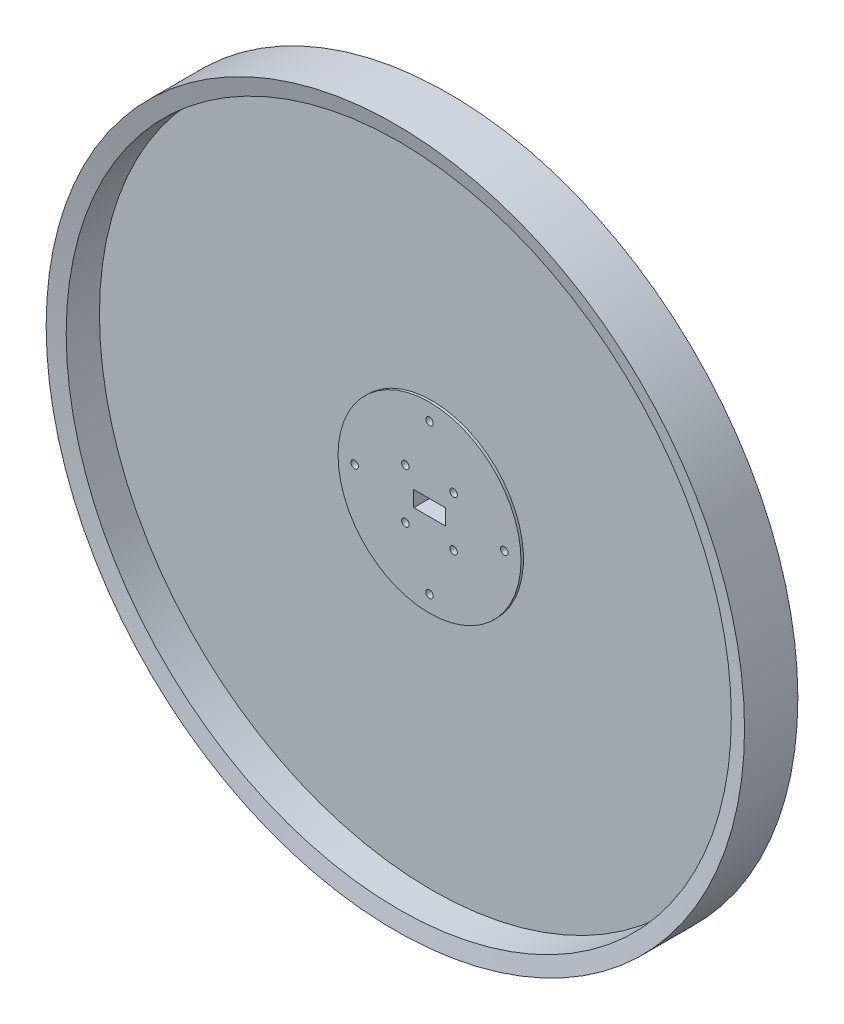
ISO-10303-21;
HEADER;
FILE_DESCRIPTION(('STEP AP214'),'2;1');
FILE_NAME('part.step','',(''),(''),'','','');
FILE_SCHEMA(('AUTOMOTIVE_DESIGN { 1 0 10303 214 1 1 1 1 }'));
ENDSEC;
DATA;
#1=APPLICATION_CONTEXT('core data for automotive mechanical design processes');
#2=APPLICATION_PROTOCOL_DEFINITION('international standard','automotive_design',2000,#1);
#3=PRODUCT_CONTEXT('',#1,'mechanical');
#4=PRODUCT('Part','Part','',(#3));
#5=PRODUCT_RELATED_PRODUCT_CATEGORY('part','',(#4));
#6=PRODUCT_DEFINITION_FORMATION('','',#4);
#7=PRODUCT_DEFINITION_CONTEXT('part definition',#1,'design');
#8=PRODUCT_DEFINITION('design','',#6,#7);
#9=PRODUCT_DEFINITION_SHAPE('','',#8);
#10=(LENGTH_UNIT() NAMED_UNIT(*) SI_UNIT(.MILLI.,.METRE.));
#11=(NAMED_UNIT(*) PLANE_ANGLE_UNIT() SI_UNIT($,.RADIAN.));
#12=(NAMED_UNIT(*) SI_UNIT($,.STERADIAN.) SOLID_ANGLE_UNIT());
#13=UNCERTAINTY_MEASURE_WITH_UNIT(LENGTH_MEASURE(1.E-05),#10,'distance_accuracy_value','');
#14=(GEOMETRIC_REPRESENTATION_CONTEXT(3) GLOBAL_UNCERTAINTY_ASSIGNED_CONTEXT((#13)) GLOBAL_UNIT_ASSIGNED_CONTEXT((#10,
#11,#12)) REPRESENTATION_CONTEXT('',''));
#15=CARTESIAN_POINT('',(0.,0.,0.));
#16=DIRECTION('',(0.,0.,1.));
#17=DIRECTION('',(1.,0.,0.));
#18=AXIS2_PLACEMENT_3D('',#15,#16,#17);
#19=CARTESIAN_POINT('',(0.,0.,-9.99999999999996));
#20=DIRECTION('',(0.,0.,-1.));
#21=DIRECTION('',(-1.,0.,0.));
#22=AXIS2_PLACEMENT_3D('',#19,#20,#21);
#23=CYLINDRICAL_SURFACE('',#22,199.999999999999);
#24=CARTESIAN_POINT('',(0.,0.,19.9999999999996));
#25=DIRECTION('',(0.,0.,-1.));
#26=DIRECTION('',(-1.,0.,0.));
#27=AXIS2_PLACEMENT_3D('',#24,#25,#26);
#28=CIRCLE('',#27,199.999999999997);
#29=CARTESIAN_POINT('',(-199.999999999997,0.,19.9999999999996));
#30=VERTEX_POINT('',#29);
#31=EDGE_CURVE('E110',#30,#30,#28,.T.);
#32=ORIENTED_EDGE('',*,*,#31,.F.);
#33=EDGE_LOOP('',(#32));
#34=FACE_BOUND('',#33,.T.);
#35=CARTESIAN_POINT('',(0.,0.,0.));
#36=DIRECTION('',(0.,0.,-1.));
#37=DIRECTION('',(-1.,0.,0.));
#38=AXIS2_PLACEMENT_3D('',#35,#36,#37);
#39=CIRCLE('',#38,200.);
#40=CARTESIAN_POINT('',(-200.,0.,0.));
#41=VERTEX_POINT('',#40);
#42=EDGE_CURVE('E40',#41,#41,#39,.T.);
#43=ORIENTED_EDGE('',*,*,#42,.T.);
#44=EDGE_LOOP('',(#43));
#45=FACE_BOUND('',#44,.T.);
#46=ADVANCED_FACE('F32',(#34,#45),#23,.F.);
#47=CARTESIAN_POINT('',(0.,0.,0.));
#48=DIRECTION('',(0.,0.,-1.));
#49=DIRECTION('',(-1.,0.,0.));
#50=AXIS2_PLACEMENT_3D('',#47,#48,#49);
#51=PLANE('',#50);
#52=CARTESIAN_POINT('',(0.,0.,0.));
#53=DIRECTION('',(0.,0.,-1.));
#54=DIRECTION('',(-1.,0.,0.));
#55=AXIS2_PLACEMENT_3D('',#52,#53,#54);
#56=CIRCLE('',#55,55.);
#57=CARTESIAN_POINT('',(-55.,0.,0.));
#58=VERTEX_POINT('',#57);
#59=EDGE_CURVE('E11',#58,#58,#56,.F.);
#60=ORIENTED_EDGE('',*,*,#59,.F.);
#61=EDGE_LOOP('',(#60));
#62=FACE_BOUND('',#61,.T.);
#63=ORIENTED_EDGE('',*,*,#42,.F.);
#64=EDGE_LOOP('',(#63));
#65=FACE_BOUND('',#64,.T.);
#66=ADVANCED_FACE('F188',(#62,#65),#51,.F.);
#67=CARTESIAN_POINT('',(210.,0.,-9.99999999999997));
#68=DIRECTION('',(0.,0.,1.));
#69=DIRECTION('',(1.,0.,0.));
#70=AXIS2_PLACEMENT_3D('',#67,#68,#69);
#71=PLANE('',#70);
#72=CARTESIAN_POINT('',(-14.5,15.,-9.99999999999999));
#73=DIRECTION('',(0.,0.,-1.));
#74=DIRECTION('',(-1.,0.,0.));
#75=AXIS2_PLACEMENT_3D('',#72,#73,#74);
#76=CIRCLE('',#75,2.275);
#77=CARTESIAN_POINT('',(-16.775,15.,-9.99999999999999));
#78=VERTEX_POINT('',#77);
#79=EDGE_CURVE('E283',#78,#78,#76,.T.);
#80=ORIENTED_EDGE('',*,*,#79,.F.);
#81=EDGE_LOOP('',(#80));
#82=FACE_BOUND('',#81,.T.);
#83=CARTESIAN_POINT('',(14.5,15.,-9.99999999999999));
#84=DIRECTION('',(0.,0.,-1.));
#85=DIRECTION('',(-1.,0.,0.));
#86=AXIS2_PLACEMENT_3D('',#83,#84,#85);
#87=CIRCLE('',#86,2.275);
#88=CARTESIAN_POINT('',(12.225,15.,-9.99999999999999));
#89=VERTEX_POINT('',#88);
#90=EDGE_CURVE('E141',#89,#89,#87,.T.);
#91=ORIENTED_EDGE('',*,*,#90,.F.);
#92=EDGE_LOOP('',(#91));
#93=FACE_BOUND('',#92,.T.);
#94=CARTESIAN_POINT('',(14.5,-15.,-9.99999999999999));
#95=DIRECTION('',(0.,0.,-1.));
#96=DIRECTION('',(-1.,0.,0.));
#97=AXIS2_PLACEMENT_3D('',#94,#95,#96);
#98=CIRCLE('',#97,2.275);
#99=CARTESIAN_POINT('',(12.225,-15.,-9.99999999999999));
#100=VERTEX_POINT('',#99);
#101=EDGE_CURVE('E134',#100,#100,#98,.T.);
#102=ORIENTED_EDGE('',*,*,#101,.F.);
#103=EDGE_LOOP('',(#102));
#104=FACE_BOUND('',#103,.T.);
#105=CARTESIAN_POINT('',(-14.5,-15.,-9.99999999999999));
#106=DIRECTION('',(0.,0.,-1.));
#107=DIRECTION('',(-1.,0.,0.));
#108=AXIS2_PLACEMENT_3D('',#105,#106,#107);
#109=CIRCLE('',#108,2.275);
#110=CARTESIAN_POINT('',(-16.775,-15.,-9.99999999999999));
#111=VERTEX_POINT('',#110);
#112=EDGE_CURVE('E130',#111,#111,#109,.T.);
#113=ORIENTED_EDGE('',*,*,#112,.F.);
#114=EDGE_LOOP('',(#113));
#115=FACE_BOUND('',#114,.T.);
#116=CARTESIAN_POINT('',(45.,4.71349980743823E-13,-10.));
#117=DIRECTION('',(0.,0.,1.));
#118=DIRECTION('',(1.,0.,0.));
#119=AXIS2_PLACEMENT_3D('',#116,#117,#118);
#120=CIRCLE('',#119,2.25);
#121=CARTESIAN_POINT('',(47.25,4.71349980743823E-13,-10.));
#122=VERTEX_POINT('',#121);
#123=EDGE_CURVE('E157',#122,#122,#120,.T.);
#124=ORIENTED_EDGE('',*,*,#123,.T.);
#125=EDGE_LOOP('',(#124));
#126=FACE_BOUND('',#125,.T.);
#127=CARTESIAN_POINT('',(0.,-45.,-10.));
#128=DIRECTION('',(0.,0.,1.));
#129=DIRECTION('',(1.,0.,0.));
#130=AXIS2_PLACEMENT_3D('',#127,#128,#129);
#131=CIRCLE('',#130,2.25);
#132=CARTESIAN_POINT('',(2.25,-45.,-10.));
#133=VERTEX_POINT('',#132);
#134=EDGE_CURVE('E163',#133,#133,#131,.T.);
#135=ORIENTED_EDGE('',*,*,#134,.T.);
#136=EDGE_LOOP('',(#135));
#137=FACE_BOUND('',#136,.T.);
#138=CARTESIAN_POINT('',(-45.,-1.57116660247941E-13,-10.));
#139=DIRECTION('',(0.,0.,1.));
#140=DIRECTION('',(1.,0.,0.));
#141=AXIS2_PLACEMENT_3D('',#138,#139,#140);
#142=CIRCLE('',#141,2.25);
#143=CARTESIAN_POINT('',(-42.75,-1.57116660247941E-13,-10.));
#144=VERTEX_POINT('',#143);
#145=EDGE_CURVE('E169',#144,#144,#142,.T.);
#146=ORIENTED_EDGE('',*,*,#145,.T.);
#147=EDGE_LOOP('',(#146));
#148=FACE_BOUND('',#147,.T.);
#149=CARTESIAN_POINT('',(0.,45.,-10.));
#150=DIRECTION('',(0.,0.,1.));
#151=DIRECTION('',(1.,0.,0.));
#152=AXIS2_PLACEMENT_3D('',#149,#150,#151);
#153=CIRCLE('',#152,2.25);
#154=CARTESIAN_POINT('',(2.25,45.,-10.));
#155=VERTEX_POINT('',#154);
#156=EDGE_CURVE('E175',#155,#155,#153,.T.);
#157=ORIENTED_EDGE('',*,*,#156,.T.);
#158=EDGE_LOOP('',(#157));
#159=FACE_BOUND('',#158,.T.);
#160=DIRECTION('',(1.,0.,0.));
#161=VECTOR('',#160,1.);
#162=CARTESIAN_POINT('',(-9.5,-4.75,-10.));
#163=LINE('',#162,#161);
#164=CARTESIAN_POINT('',(-9.5,-4.75,-10.));
#165=VERTEX_POINT('',#164);
#166=CARTESIAN_POINT('',(9.5,-4.75,-10.));
#167=VERTEX_POINT('',#166);
#168=EDGE_CURVE('E105',#165,#167,#163,.T.);
#169=ORIENTED_EDGE('',*,*,#168,.T.);
#170=DIRECTION('',(0.,1.,0.));
#171=VECTOR('',#170,1.);
#172=CARTESIAN_POINT('',(9.5,-4.75,-10.));
#173=LINE('',#172,#171);
#174=CARTESIAN_POINT('',(9.5,4.75,-10.));
#175=VERTEX_POINT('',#174);
#176=EDGE_CURVE('E99',#167,#175,#173,.T.);
#177=ORIENTED_EDGE('',*,*,#176,.T.);
#178=DIRECTION('',(-1.,0.,0.));
#179=VECTOR('',#178,1.);
#180=CARTESIAN_POINT('',(-9.5,4.75,-10.));
#181=LINE('',#180,#179);
#182=CARTESIAN_POINT('',(-9.50000000000001,4.75,-9.99999999999998));
#183=VERTEX_POINT('',#182);
#184=EDGE_CURVE('E102',#175,#183,#181,.T.);
#185=ORIENTED_EDGE('',*,*,#184,.T.);
#186=DIRECTION('',(0.,-1.,0.));
#187=VECTOR('',#186,1.);
#188=CARTESIAN_POINT('',(-9.5,-4.75,-10.));
#189=LINE('',#188,#187);
#190=EDGE_CURVE('E56',#183,#165,#189,.T.);
#191=ORIENTED_EDGE('',*,*,#190,.T.);
#192=EDGE_LOOP('',(#169,#177,#185,#191));
#193=FACE_BOUND('',#192,.T.);
#194=CARTESIAN_POINT('',(0.,0.,-9.99999999999999));
#195=DIRECTION('',(0.,0.,-1.));
#196=DIRECTION('',(-1.,0.,0.));
#197=AXIS2_PLACEMENT_3D('',#194,#195,#196);
#198=CIRCLE('',#197,210.);
#199=CARTESIAN_POINT('',(-210.,0.,-10.));
#200=VERTEX_POINT('',#199);
#201=EDGE_CURVE('E118',#200,#200,#198,.T.);
#202=ORIENTED_EDGE('',*,*,#201,.T.);
#203=EDGE_LOOP('',(#202));
#204=FACE_BOUND('',#203,.T.);
#205=ADVANCED_FACE('F184',(#82,#93,#104,#115,#126,#137,#148,#159,#193,#204),#71,.F.);
#206=CARTESIAN_POINT('',(0.,0.,-9.99999999999996));
#207=DIRECTION('',(0.,0.,-1.));
#208=DIRECTION('',(-1.,0.,0.));
#209=AXIS2_PLACEMENT_3D('',#206,#207,#208);
#210=CYLINDRICAL_SURFACE('',#209,210.000000000002);
#211=ORIENTED_EDGE('',*,*,#201,.F.);
#212=EDGE_LOOP('',(#211));
#213=FACE_BOUND('',#212,.T.);
#214=CARTESIAN_POINT('',(0.,0.,22.0500000000006));
#215=DIRECTION('',(0.,0.,-1.));
#216=DIRECTION('',(-1.,0.,0.));
#217=AXIS2_PLACEMENT_3D('',#214,#215,#216);
#218=CIRCLE('',#217,210.000000000004);
#219=CARTESIAN_POINT('',(-210.000000000004,0.,22.0500000000006));
#220=VERTEX_POINT('',#219);
#221=EDGE_CURVE('E115',#220,#220,#218,.T.);
#222=ORIENTED_EDGE('',*,*,#221,.T.);
#223=EDGE_LOOP('',(#222));
#224=FACE_BOUND('',#223,.T.);
#225=ADVANCED_FACE('F187',(#213,#224),#210,.T.);
#226=CARTESIAN_POINT('',(0.,0.,19.9999999999996));
#227=DIRECTION('',(0.,0.,1.));
#228=DIRECTION('',(1.,0.,0.));
#229=AXIS2_PLACEMENT_3D('',#226,#227,#228);
#230=CONICAL_SURFACE('',#229,199.999999999997,1.36859772991208);
#231=ORIENTED_EDGE('',*,*,#221,.F.);
#232=EDGE_LOOP('',(#231));
#233=FACE_BOUND('',#232,.T.);
#234=ORIENTED_EDGE('',*,*,#31,.T.);
#235=EDGE_LOOP('',(#234));
#236=FACE_BOUND('',#235,.T.);
#237=ADVANCED_FACE('F195',(#233,#236),#230,.F.);
#238=CARTESIAN_POINT('',(9.5,-4.75,-10.));
#239=DIRECTION('',(1.,0.,0.));
#240=DIRECTION('',(0.,0.,-1.));
#241=AXIS2_PLACEMENT_3D('',#238,#239,#240);
#242=PLANE('',#241);
#243=DIRECTION('',(0.,0.,1.));
#244=VECTOR('',#243,1.);
#245=CARTESIAN_POINT('',(9.5,-4.75,-10.));
#246=LINE('',#245,#244);
#247=CARTESIAN_POINT('',(9.50000000000001,-4.75,1.51249999997172));
#248=VERTEX_POINT('',#247);
#249=EDGE_CURVE('E108',#167,#248,#246,.T.);
#250=ORIENTED_EDGE('',*,*,#249,.T.);
#251=DIRECTION('',(0.,1.,0.));
#252=VECTOR('',#251,1.);
#253=CARTESIAN_POINT('',(9.50000000000001,-4.75,1.51249999997172));
#254=LINE('',#253,#252);
#255=CARTESIAN_POINT('',(9.50000000000001,4.75,1.51249999997172));
#256=VERTEX_POINT('',#255);
#257=EDGE_CURVE('E86',#248,#256,#254,.T.);
#258=ORIENTED_EDGE('',*,*,#257,.T.);
#259=DIRECTION('',(0.,0.,1.));
#260=VECTOR('',#259,1.);
#261=CARTESIAN_POINT('',(9.5,4.75,-10.));
#262=LINE('',#261,#260);
#263=EDGE_CURVE('E48',#175,#256,#262,.T.);
#264=ORIENTED_EDGE('',*,*,#263,.F.);
#265=ORIENTED_EDGE('',*,*,#176,.F.);
#266=EDGE_LOOP('',(#250,#258,#264,#265));
#267=FACE_BOUND('',#266,.T.);
#268=ADVANCED_FACE('F178',(#267),#242,.F.);
#269=CARTESIAN_POINT('',(-9.5,-4.75,-10.));
#270=DIRECTION('',(0.,-1.,0.));
#271=DIRECTION('',(0.,0.,-1.));
#272=AXIS2_PLACEMENT_3D('',#269,#270,#271);
#273=PLANE('',#272);
#274=DIRECTION('',(0.,0.,1.));
#275=VECTOR('',#274,1.);
#276=CARTESIAN_POINT('',(-9.5,-4.75,-10.));
#277=LINE('',#276,#275);
#278=CARTESIAN_POINT('',(-9.49999999999999,-4.75,1.51249999997172));
#279=VERTEX_POINT('',#278);
#280=EDGE_CURVE('E79',#165,#279,#277,.T.);
#281=ORIENTED_EDGE('',*,*,#280,.T.);
#282=DIRECTION('',(1.,0.,0.));
#283=VECTOR('',#282,1.);
#284=CARTESIAN_POINT('',(-9.49999999999999,-4.75,1.51249999997172));
#285=LINE('',#284,#283);
#286=EDGE_CURVE('E91',#279,#248,#285,.T.);
#287=ORIENTED_EDGE('',*,*,#286,.T.);
#288=ORIENTED_EDGE('',*,*,#249,.F.);
#289=ORIENTED_EDGE('',*,*,#168,.F.);
#290=EDGE_LOOP('',(#281,#287,#288,#289));
#291=FACE_BOUND('',#290,.T.);
#292=ADVANCED_FACE('F182',(#291),#273,.F.);
#293=CARTESIAN_POINT('',(-9.5,-4.75,-10.));
#294=DIRECTION('',(-1.,0.,0.));
#295=DIRECTION('',(0.,0.,1.));
#296=AXIS2_PLACEMENT_3D('',#293,#294,#295);
#297=PLANE('',#296);
#298=DIRECTION('',(0.,0.,1.));
#299=VECTOR('',#298,1.);
#300=CARTESIAN_POINT('',(-9.5,4.75,-10.));
#301=LINE('',#300,#299);
#302=CARTESIAN_POINT('',(-9.49999999999999,4.75,1.51249999997172));
#303=VERTEX_POINT('',#302);
#304=EDGE_CURVE('E73',#183,#303,#301,.T.);
#305=ORIENTED_EDGE('',*,*,#304,.T.);
#306=DIRECTION('',(0.,-1.,0.));
#307=VECTOR('',#306,1.);
#308=CARTESIAN_POINT('',(-9.49999999999999,-4.75,1.51249999997172));
#309=LINE('',#308,#307);
#310=EDGE_CURVE('E76',#303,#279,#309,.T.);
#311=ORIENTED_EDGE('',*,*,#310,.T.);
#312=ORIENTED_EDGE('',*,*,#280,.F.);
#313=ORIENTED_EDGE('',*,*,#190,.F.);
#314=EDGE_LOOP('',(#305,#311,#312,#313));
#315=FACE_BOUND('',#314,.T.);
#316=ADVANCED_FACE('F74',(#315),#297,.F.);
#317=CARTESIAN_POINT('',(-9.5,4.75,-10.));
#318=DIRECTION('',(0.,1.,0.));
#319=DIRECTION('',(0.,0.,1.));
#320=AXIS2_PLACEMENT_3D('',#317,#318,#319);
#321=PLANE('',#320);
#322=ORIENTED_EDGE('',*,*,#263,.T.);
#323=DIRECTION('',(-1.,0.,0.));
#324=VECTOR('',#323,1.);
#325=CARTESIAN_POINT('',(-9.49999999999999,4.75,1.51249999997172));
#326=LINE('',#325,#324);
#327=EDGE_CURVE('E82',#256,#303,#326,.T.);
#328=ORIENTED_EDGE('',*,*,#327,.T.);
#329=ORIENTED_EDGE('',*,*,#304,.F.);
#330=ORIENTED_EDGE('',*,*,#184,.F.);
#331=EDGE_LOOP('',(#322,#328,#329,#330));
#332=FACE_BOUND('',#331,.T.);
#333=ADVANCED_FACE('F83',(#332),#321,.F.);
#334=CARTESIAN_POINT('',(0.,0.,157.075991861012));
#335=DIRECTION('',(0.,0.,-1.));
#336=DIRECTION('',(-1.,0.,0.));
#337=AXIS2_PLACEMENT_3D('',#334,#335,#336);
#338=CYLINDRICAL_SURFACE('',#337,55.);
#339=ORIENTED_EDGE('',*,*,#59,.T.);
#340=EDGE_LOOP('',(#339));
#341=FACE_BOUND('',#340,.T.);
#342=CARTESIAN_POINT('',(0.,0.,1.51249999997172));
#343=DIRECTION('',(0.,0.,1.));
#344=DIRECTION('',(1.,0.,0.));
#345=AXIS2_PLACEMENT_3D('',#342,#343,#344);
#346=CIRCLE('',#345,55.);
#347=CARTESIAN_POINT('',(55.,0.,1.51249999997172));
#348=VERTEX_POINT('',#347);
#349=EDGE_CURVE('E93',#348,#348,#346,.T.);
#350=ORIENTED_EDGE('',*,*,#349,.F.);
#351=EDGE_LOOP('',(#350));
#352=FACE_BOUND('',#351,.T.);
#353=ADVANCED_FACE('F218',(#341,#352),#338,.T.);
#354=CARTESIAN_POINT('',(0.,0.,1.51249999997172));
#355=DIRECTION('',(0.,0.,1.));
#356=DIRECTION('',(1.,0.,0.));
#357=AXIS2_PLACEMENT_3D('',#354,#355,#356);
#358=PLANE('',#357);
#359=CARTESIAN_POINT('',(-14.5,15.,1.51249999997172));
#360=DIRECTION('',(0.,0.,1.));
#361=DIRECTION('',(1.,0.,0.));
#362=AXIS2_PLACEMENT_3D('',#359,#360,#361);
#363=CIRCLE('',#362,2.25);
#364=CARTESIAN_POINT('',(-12.25,15.,1.51249999997172));
#365=VERTEX_POINT('',#364);
#366=EDGE_CURVE('E35',#365,#365,#363,.T.);
#367=ORIENTED_EDGE('',*,*,#366,.F.);
#368=EDGE_LOOP('',(#367));
#369=FACE_BOUND('',#368,.T.);
#370=CARTESIAN_POINT('',(14.5,15.,1.51249999997172));
#371=DIRECTION('',(0.,0.,1.));
#372=DIRECTION('',(1.,0.,0.));
#373=AXIS2_PLACEMENT_3D('',#370,#371,#372);
#374=CIRCLE('',#373,2.25);
#375=CARTESIAN_POINT('',(16.75,15.,1.51249999997172));
#376=VERTEX_POINT('',#375);
#377=EDGE_CURVE('E132',#376,#376,#374,.T.);
#378=ORIENTED_EDGE('',*,*,#377,.F.);
#379=EDGE_LOOP('',(#378));
#380=FACE_BOUND('',#379,.T.);
#381=CARTESIAN_POINT('',(14.5,-15.,1.51249999997172));
#382=DIRECTION('',(0.,0.,1.));
#383=DIRECTION('',(1.,0.,0.));
#384=AXIS2_PLACEMENT_3D('',#381,#382,#383);
#385=CIRCLE('',#384,2.25);
#386=CARTESIAN_POINT('',(16.75,-15.,1.51249999997172));
#387=VERTEX_POINT('',#386);
#388=EDGE_CURVE('E128',#387,#387,#385,.T.);
#389=ORIENTED_EDGE('',*,*,#388,.F.);
#390=EDGE_LOOP('',(#389));
#391=FACE_BOUND('',#390,.T.);
#392=CARTESIAN_POINT('',(-14.5,-15.,1.51249999997172));
#393=DIRECTION('',(0.,0.,1.));
#394=DIRECTION('',(1.,0.,0.));
#395=AXIS2_PLACEMENT_3D('',#392,#393,#394);
#396=CIRCLE('',#395,2.25);
#397=CARTESIAN_POINT('',(-12.25,-15.,1.51249999997172));
#398=VERTEX_POINT('',#397);
#399=EDGE_CURVE('E123',#398,#398,#396,.T.);
#400=ORIENTED_EDGE('',*,*,#399,.F.);
#401=EDGE_LOOP('',(#400));
#402=FACE_BOUND('',#401,.T.);
#403=CARTESIAN_POINT('',(45.,4.71349980743823E-13,1.51249999997173));
#404=DIRECTION('',(0.,0.,1.));
#405=DIRECTION('',(1.,0.,0.));
#406=AXIS2_PLACEMENT_3D('',#403,#404,#405);
#407=CIRCLE('',#406,2.24999999999999);
#408=CARTESIAN_POINT('',(47.25,4.71349980743823E-13,1.51249999997173));
#409=VERTEX_POINT('',#408);
#410=EDGE_CURVE('E126',#409,#409,#407,.T.);
#411=ORIENTED_EDGE('',*,*,#410,.F.);
#412=EDGE_LOOP('',(#411));
#413=FACE_BOUND('',#412,.T.);
#414=CARTESIAN_POINT('',(0.,-45.,1.51249999997173));
#415=DIRECTION('',(0.,0.,1.));
#416=DIRECTION('',(1.,0.,0.));
#417=AXIS2_PLACEMENT_3D('',#414,#415,#416);
#418=CIRCLE('',#417,2.24999999999999);
#419=CARTESIAN_POINT('',(2.24999999999999,-45.,1.51249999997173));
#420=VERTEX_POINT('',#419);
#421=EDGE_CURVE('E160',#420,#420,#418,.T.);
#422=ORIENTED_EDGE('',*,*,#421,.F.);
#423=EDGE_LOOP('',(#422));
#424=FACE_BOUND('',#423,.T.);
#425=CARTESIAN_POINT('',(-45.,-1.57116660247941E-13,1.51249999997173));
#426=DIRECTION('',(0.,0.,1.));
#427=DIRECTION('',(1.,0.,0.));
#428=AXIS2_PLACEMENT_3D('',#425,#426,#427);
#429=CIRCLE('',#428,2.24999999999999);
#430=CARTESIAN_POINT('',(-42.75,-1.57116660247941E-13,1.51249999997173));
#431=VERTEX_POINT('',#430);
#432=EDGE_CURVE('E166',#431,#431,#429,.T.);
#433=ORIENTED_EDGE('',*,*,#432,.F.);
#434=EDGE_LOOP('',(#433));
#435=FACE_BOUND('',#434,.T.);
#436=CARTESIAN_POINT('',(0.,45.,1.51249999997173));
#437=DIRECTION('',(0.,0.,1.));
#438=DIRECTION('',(1.,0.,0.));
#439=AXIS2_PLACEMENT_3D('',#436,#437,#438);
#440=CIRCLE('',#439,2.24999999999999);
#441=CARTESIAN_POINT('',(2.24999999999999,45.,1.51249999997173));
#442=VERTEX_POINT('',#441);
#443=EDGE_CURVE('E172',#442,#442,#440,.T.);
#444=ORIENTED_EDGE('',*,*,#443,.F.);
#445=EDGE_LOOP('',(#444));
#446=FACE_BOUND('',#445,.T.);
#447=ORIENTED_EDGE('',*,*,#257,.F.);
#448=ORIENTED_EDGE('',*,*,#286,.F.);
#449=ORIENTED_EDGE('',*,*,#310,.F.);
#450=ORIENTED_EDGE('',*,*,#327,.F.);
#451=EDGE_LOOP('',(#447,#448,#449,#450));
#452=FACE_BOUND('',#451,.T.);
#453=ORIENTED_EDGE('',*,*,#349,.T.);
#454=EDGE_LOOP('',(#453));
#455=FACE_BOUND('',#454,.T.);
#456=ADVANCED_FACE('F88',(#369,#380,#391,#402,#413,#424,#435,#446,#452,#455),#358,.T.);
#457=CARTESIAN_POINT('',(0.,45.,1.51249999997172));
#458=DIRECTION('',(0.,0.,1.));
#459=DIRECTION('',(1.,0.,0.));
#460=AXIS2_PLACEMENT_3D('',#457,#458,#459);
#461=CYLINDRICAL_SURFACE('',#460,2.24999999999999);
#462=ORIENTED_EDGE('',*,*,#156,.F.);
#463=EDGE_LOOP('',(#462));
#464=FACE_BOUND('',#463,.T.);
#465=ORIENTED_EDGE('',*,*,#443,.T.);
#466=EDGE_LOOP('',(#465));
#467=FACE_BOUND('',#466,.T.);
#468=ADVANCED_FACE('F225',(#464,#467),#461,.F.);
#469=CARTESIAN_POINT('',(-45.,-1.57116660247941E-13,1.51249999997172));
#470=DIRECTION('',(0.,0.,1.));
#471=DIRECTION('',(1.,0.,0.));
#472=AXIS2_PLACEMENT_3D('',#469,#470,#471);
#473=CYLINDRICAL_SURFACE('',#472,2.24999999999999);
#474=ORIENTED_EDGE('',*,*,#145,.F.);
#475=EDGE_LOOP('',(#474));
#476=FACE_BOUND('',#475,.T.);
#477=ORIENTED_EDGE('',*,*,#432,.T.);
#478=EDGE_LOOP('',(#477));
#479=FACE_BOUND('',#478,.T.);
#480=ADVANCED_FACE('F232',(#476,#479),#473,.F.);
#481=CARTESIAN_POINT('',(0.,-45.,1.51249999997172));
#482=DIRECTION('',(0.,0.,1.));
#483=DIRECTION('',(1.,0.,0.));
#484=AXIS2_PLACEMENT_3D('',#481,#482,#483);
#485=CYLINDRICAL_SURFACE('',#484,2.24999999999999);
#486=ORIENTED_EDGE('',*,*,#134,.F.);
#487=EDGE_LOOP('',(#486));
#488=FACE_BOUND('',#487,.T.);
#489=ORIENTED_EDGE('',*,*,#421,.T.);
#490=EDGE_LOOP('',(#489));
#491=FACE_BOUND('',#490,.T.);
#492=ADVANCED_FACE('F236',(#488,#491),#485,.F.);
#493=CARTESIAN_POINT('',(45.,4.71349980743823E-13,1.51249999997172));
#494=DIRECTION('',(0.,0.,1.));
#495=DIRECTION('',(1.,0.,0.));
#496=AXIS2_PLACEMENT_3D('',#493,#494,#495);
#497=CYLINDRICAL_SURFACE('',#496,2.24999999999999);
#498=ORIENTED_EDGE('',*,*,#123,.F.);
#499=EDGE_LOOP('',(#498));
#500=FACE_BOUND('',#499,.T.);
#501=ORIENTED_EDGE('',*,*,#410,.T.);
#502=EDGE_LOOP('',(#501));
#503=FACE_BOUND('',#502,.T.);
#504=ADVANCED_FACE('F240',(#500,#503),#497,.F.);
#505=CARTESIAN_POINT('',(-14.5,-15.,-9.99999999999998));
#506=DIRECTION('',(0.,0.,-1.));
#507=DIRECTION('',(-1.,0.,0.));
#508=AXIS2_PLACEMENT_3D('',#505,#506,#507);
#509=CYLINDRICAL_SURFACE('',#508,2.25);
#510=ORIENTED_EDGE('',*,*,#399,.T.);
#511=EDGE_LOOP('',(#510));
#512=FACE_BOUND('',#511,.T.);
#513=CARTESIAN_POINT('',(-14.5,-15.,-9.97499999999998));
#514=DIRECTION('',(0.,0.,-1.));
#515=DIRECTION('',(-1.,0.,0.));
#516=AXIS2_PLACEMENT_3D('',#513,#514,#515);
#517=CIRCLE('',#516,2.25);
#518=CARTESIAN_POINT('',(-16.75,-15.,-9.97499999999998));
#519=VERTEX_POINT('',#518);
#520=EDGE_CURVE('E127',#519,#519,#517,.T.);
#521=ORIENTED_EDGE('',*,*,#520,.T.);
#522=EDGE_LOOP('',(#521));
#523=FACE_BOUND('',#522,.T.);
#524=ADVANCED_FACE('F244',(#512,#523),#509,.F.);
#525=CARTESIAN_POINT('',(-14.5,-15.,-9.99999999999999));
#526=DIRECTION('',(0.,0.,-1.));
#527=DIRECTION('',(-1.,0.,0.));
#528=AXIS2_PLACEMENT_3D('',#525,#526,#527);
#529=CONICAL_SURFACE('',#528,2.275,0.785398163397379);
#530=ORIENTED_EDGE('',*,*,#520,.F.);
#531=EDGE_LOOP('',(#530));
#532=FACE_BOUND('',#531,.T.);
#533=ORIENTED_EDGE('',*,*,#112,.T.);
#534=EDGE_LOOP('',(#533));
#535=FACE_BOUND('',#534,.T.);
#536=ADVANCED_FACE('F248',(#532,#535),#529,.F.);
#537=CARTESIAN_POINT('',(14.5,-15.,-9.99999999999998));
#538=DIRECTION('',(0.,0.,-1.));
#539=DIRECTION('',(-1.,0.,0.));
#540=AXIS2_PLACEMENT_3D('',#537,#538,#539);
#541=CYLINDRICAL_SURFACE('',#540,2.25);
#542=ORIENTED_EDGE('',*,*,#388,.T.);
#543=EDGE_LOOP('',(#542));
#544=FACE_BOUND('',#543,.T.);
#545=CARTESIAN_POINT('',(14.5,-15.,-9.97499999999998));
#546=DIRECTION('',(0.,0.,-1.));
#547=DIRECTION('',(-1.,0.,0.));
#548=AXIS2_PLACEMENT_3D('',#545,#546,#547);
#549=CIRCLE('',#548,2.25);
#550=CARTESIAN_POINT('',(12.25,-15.,-9.97499999999998));
#551=VERTEX_POINT('',#550);
#552=EDGE_CURVE('E131',#551,#551,#549,.T.);
#553=ORIENTED_EDGE('',*,*,#552,.T.);
#554=EDGE_LOOP('',(#553));
#555=FACE_BOUND('',#554,.T.);
#556=ADVANCED_FACE('F252',(#544,#555),#541,.F.);
#557=CARTESIAN_POINT('',(14.5,-15.,-9.99999999999999));
#558=DIRECTION('',(0.,0.,-1.));
#559=DIRECTION('',(-1.,0.,0.));
#560=AXIS2_PLACEMENT_3D('',#557,#558,#559);
#561=CONICAL_SURFACE('',#560,2.275,0.785398163397414);
#562=ORIENTED_EDGE('',*,*,#552,.F.);
#563=EDGE_LOOP('',(#562));
#564=FACE_BOUND('',#563,.T.);
#565=ORIENTED_EDGE('',*,*,#101,.T.);
#566=EDGE_LOOP('',(#565));
#567=FACE_BOUND('',#566,.T.);
#568=ADVANCED_FACE('F256',(#564,#567),#561,.F.);
#569=CARTESIAN_POINT('',(14.5,15.,-9.99999999999998));
#570=DIRECTION('',(0.,0.,-1.));
#571=DIRECTION('',(-1.,0.,0.));
#572=AXIS2_PLACEMENT_3D('',#569,#570,#571);
#573=CYLINDRICAL_SURFACE('',#572,2.25);
#574=ORIENTED_EDGE('',*,*,#377,.T.);
#575=EDGE_LOOP('',(#574));
#576=FACE_BOUND('',#575,.T.);
#577=CARTESIAN_POINT('',(14.5,15.,-9.97499999999998));
#578=DIRECTION('',(0.,0.,-1.));
#579=DIRECTION('',(-1.,0.,0.));
#580=AXIS2_PLACEMENT_3D('',#577,#578,#579);
#581=CIRCLE('',#580,2.25);
#582=CARTESIAN_POINT('',(12.25,15.,-9.97499999999998));
#583=VERTEX_POINT('',#582);
#584=EDGE_CURVE('E135',#583,#583,#581,.T.);
#585=ORIENTED_EDGE('',*,*,#584,.T.);
#586=EDGE_LOOP('',(#585));
#587=FACE_BOUND('',#586,.T.);
#588=ADVANCED_FACE('F260',(#576,#587),#573,.F.);
#589=CARTESIAN_POINT('',(14.5,15.,-9.99999999999999));
#590=DIRECTION('',(0.,0.,-1.));
#591=DIRECTION('',(-1.,0.,0.));
#592=AXIS2_PLACEMENT_3D('',#589,#590,#591);
#593=CONICAL_SURFACE('',#592,2.275,0.785398163397414);
#594=ORIENTED_EDGE('',*,*,#584,.F.);
#595=EDGE_LOOP('',(#594));
#596=FACE_BOUND('',#595,.T.);
#597=ORIENTED_EDGE('',*,*,#90,.T.);
#598=EDGE_LOOP('',(#597));
#599=FACE_BOUND('',#598,.T.);
#600=ADVANCED_FACE('F264',(#596,#599),#593,.F.);
#601=CARTESIAN_POINT('',(-14.5,15.,-9.99999999999998));
#602=DIRECTION('',(0.,0.,-1.));
#603=DIRECTION('',(-1.,0.,0.));
#604=AXIS2_PLACEMENT_3D('',#601,#602,#603);
#605=CYLINDRICAL_SURFACE('',#604,2.25);
#606=ORIENTED_EDGE('',*,*,#366,.T.);
#607=EDGE_LOOP('',(#606));
#608=FACE_BOUND('',#607,.T.);
#609=CARTESIAN_POINT('',(-14.5,15.,-9.97499999999998));
#610=DIRECTION('',(0.,0.,-1.));
#611=DIRECTION('',(-1.,0.,0.));
#612=AXIS2_PLACEMENT_3D('',#609,#610,#611);
#613=CIRCLE('',#612,2.25);
#614=CARTESIAN_POINT('',(-16.75,15.,-9.97499999999998));
#615=VERTEX_POINT('',#614);
#616=EDGE_CURVE('E280',#615,#615,#613,.T.);
#617=ORIENTED_EDGE('',*,*,#616,.T.);
#618=EDGE_LOOP('',(#617));
#619=FACE_BOUND('',#618,.T.);
#620=ADVANCED_FACE('F267',(#608,#619),#605,.F.);
#621=CARTESIAN_POINT('',(-14.5,15.,-9.99999999999999));
#622=DIRECTION('',(0.,0.,-1.));
#623=DIRECTION('',(-1.,0.,0.));
#624=AXIS2_PLACEMENT_3D('',#621,#622,#623);
#625=CONICAL_SURFACE('',#624,2.275,0.785398163397379);
#626=ORIENTED_EDGE('',*,*,#616,.F.);
#627=EDGE_LOOP('',(#626));
#628=FACE_BOUND('',#627,.T.);
#629=ORIENTED_EDGE('',*,*,#79,.T.);
#630=EDGE_LOOP('',(#629));
#631=FACE_BOUND('',#630,.T.);
#632=ADVANCED_FACE('F271',(#628,#631),#625,.F.);
#633=CLOSED_SHELL('',(#46,#66,#205,#225,#237,#268,#292,#316,#333,#353,#456,#468,#480,#492,#504,
#524,#536,#556,#568,#588,#600,#620,#632));
#634=MANIFOLD_SOLID_BREP('B2',#633);
#635=ADVANCED_BREP_SHAPE_REPRESENTATION('',(#18,#634),#14);
#636=SHAPE_DEFINITION_REPRESENTATION(#9,#635);
ENDSEC;
END-ISO-10303-21;
